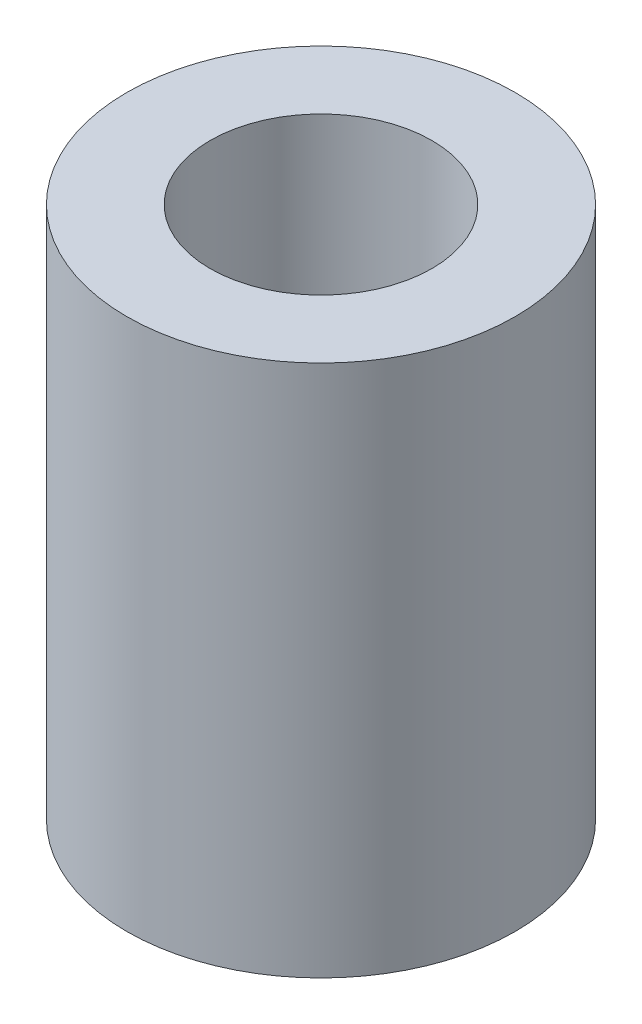
ISO-10303-21;
HEADER;
FILE_DESCRIPTION(('STEP AP214'),'2;1');
FILE_NAME('part.step','',(''),(''),'','','');
FILE_SCHEMA(('AUTOMOTIVE_DESIGN { 1 0 10303 214 1 1 1 1 }'));
ENDSEC;
DATA;
#1=APPLICATION_CONTEXT('core data for automotive mechanical design processes');
#2=APPLICATION_PROTOCOL_DEFINITION('international standard','automotive_design',2000,#1);
#3=PRODUCT_CONTEXT('',#1,'mechanical');
#4=PRODUCT('Part','Part','',(#3));
#5=PRODUCT_RELATED_PRODUCT_CATEGORY('part','',(#4));
#6=PRODUCT_DEFINITION_FORMATION('','',#4);
#7=PRODUCT_DEFINITION_CONTEXT('part definition',#1,'design');
#8=PRODUCT_DEFINITION('design','',#6,#7);
#9=PRODUCT_DEFINITION_SHAPE('','',#8);
#10=(LENGTH_UNIT() NAMED_UNIT(*) SI_UNIT(.MILLI.,.METRE.));
#11=(NAMED_UNIT(*) PLANE_ANGLE_UNIT() SI_UNIT($,.RADIAN.));
#12=(NAMED_UNIT(*) SI_UNIT($,.STERADIAN.) SOLID_ANGLE_UNIT());
#13=UNCERTAINTY_MEASURE_WITH_UNIT(LENGTH_MEASURE(1.E-05),#10,'distance_accuracy_value','');
#14=(GEOMETRIC_REPRESENTATION_CONTEXT(3) GLOBAL_UNCERTAINTY_ASSIGNED_CONTEXT((#13)) GLOBAL_UNIT_ASSIGNED_CONTEXT((#10,
#11,#12)) REPRESENTATION_CONTEXT('',''));
#15=CARTESIAN_POINT('',(0.,0.,0.));
#16=DIRECTION('',(0.,0.,1.));
#17=DIRECTION('',(1.,0.,0.));
#18=AXIS2_PLACEMENT_3D('',#15,#16,#17);
#19=CARTESIAN_POINT('',(0.,12.192,0.));
#20=DIRECTION('',(0.,1.,0.));
#21=DIRECTION('',(0.,0.,1.));
#22=AXIS2_PLACEMENT_3D('',#19,#20,#21);
#23=PLANE('',#22);
#24=CARTESIAN_POINT('',(0.,12.192,0.));
#25=DIRECTION('',(0.,1.,0.));
#26=DIRECTION('',(0.,0.,1.));
#27=AXIS2_PLACEMENT_3D('',#24,#25,#26);
#28=CIRCLE('',#27,4.445);
#29=CARTESIAN_POINT('',(0.,12.192,-4.445));
#30=VERTEX_POINT('',#29);
#31=EDGE_CURVE('E10',#30,#30,#28,.T.);
#32=ORIENTED_EDGE('',*,*,#31,.T.);
#33=EDGE_LOOP('',(#32));
#34=FACE_BOUND('',#33,.T.);
#35=CARTESIAN_POINT('',(0.,12.192,0.));
#36=DIRECTION('',(0.,1.,0.));
#37=DIRECTION('',(0.,0.,1.));
#38=AXIS2_PLACEMENT_3D('',#35,#36,#37);
#39=CIRCLE('',#38,2.54);
#40=CARTESIAN_POINT('',(0.,12.192,-2.54));
#41=VERTEX_POINT('',#40);
#42=EDGE_CURVE('E46',#41,#41,#39,.T.);
#43=ORIENTED_EDGE('',*,*,#42,.F.);
#44=EDGE_LOOP('',(#43));
#45=FACE_BOUND('',#44,.T.);
#46=ADVANCED_FACE('F35',(#34,#45),#23,.T.);
#47=CARTESIAN_POINT('',(0.,0.,0.));
#48=DIRECTION('',(0.,1.,0.));
#49=DIRECTION('',(0.,0.,1.));
#50=AXIS2_PLACEMENT_3D('',#47,#48,#49);
#51=PLANE('',#50);
#52=CARTESIAN_POINT('',(0.,0.,0.));
#53=DIRECTION('',(0.,1.,0.));
#54=DIRECTION('',(0.,0.,1.));
#55=AXIS2_PLACEMENT_3D('',#52,#53,#54);
#56=CIRCLE('',#55,4.445);
#57=CARTESIAN_POINT('',(0.,0.,-4.445));
#58=VERTEX_POINT('',#57);
#59=EDGE_CURVE('E39',#58,#58,#56,.T.);
#60=ORIENTED_EDGE('',*,*,#59,.F.);
#61=EDGE_LOOP('',(#60));
#62=FACE_BOUND('',#61,.T.);
#63=CARTESIAN_POINT('',(0.,0.,0.));
#64=DIRECTION('',(0.,1.,0.));
#65=DIRECTION('',(0.,0.,1.));
#66=AXIS2_PLACEMENT_3D('',#63,#64,#65);
#67=CIRCLE('',#66,2.54);
#68=CARTESIAN_POINT('',(0.,0.,-2.54));
#69=VERTEX_POINT('',#68);
#70=EDGE_CURVE('E48',#69,#69,#67,.T.);
#71=ORIENTED_EDGE('',*,*,#70,.T.);
#72=EDGE_LOOP('',(#71));
#73=FACE_BOUND('',#72,.T.);
#74=ADVANCED_FACE('F58',(#62,#73),#51,.F.);
#75=CARTESIAN_POINT('',(0.,12.192,0.));
#76=DIRECTION('',(0.,-1.,0.));
#77=DIRECTION('',(0.,0.,-1.));
#78=AXIS2_PLACEMENT_3D('',#75,#76,#77);
#79=CYLINDRICAL_SURFACE('',#78,4.445);
#80=CARTESIAN_POINT('',(0.,12.192,-4.445));
#81=CARTESIAN_POINT('',(0.,12.065,-4.445));
#82=CARTESIAN_POINT('',(0.,11.938,-4.445));
#83=CARTESIAN_POINT('',(0.,11.684,-4.445));
#84=CARTESIAN_POINT('',(0.,11.557,-4.445));
#85=CARTESIAN_POINT('',(0.,11.303,-4.445));
#86=CARTESIAN_POINT('',(0.,11.176,-4.445));
#87=CARTESIAN_POINT('',(0.,10.922,-4.445));
#88=CARTESIAN_POINT('',(0.,10.795,-4.445));
#89=CARTESIAN_POINT('',(0.,10.541,-4.445));
#90=CARTESIAN_POINT('',(0.,10.414,-4.445));
#91=CARTESIAN_POINT('',(0.,10.16,-4.445));
#92=CARTESIAN_POINT('',(0.,10.033,-4.445));
#93=CARTESIAN_POINT('',(0.,9.779,-4.445));
#94=CARTESIAN_POINT('',(0.,9.652,-4.445));
#95=CARTESIAN_POINT('',(0.,9.398,-4.445));
#96=CARTESIAN_POINT('',(0.,9.271,-4.445));
#97=CARTESIAN_POINT('',(0.,9.017,-4.445));
#98=CARTESIAN_POINT('',(0.,8.89,-4.445));
#99=CARTESIAN_POINT('',(0.,8.636,-4.445));
#100=CARTESIAN_POINT('',(0.,8.509,-4.445));
#101=CARTESIAN_POINT('',(0.,8.255,-4.445));
#102=CARTESIAN_POINT('',(0.,8.128,-4.445));
#103=CARTESIAN_POINT('',(0.,7.874,-4.445));
#104=CARTESIAN_POINT('',(0.,7.747,-4.445));
#105=CARTESIAN_POINT('',(0.,7.493,-4.445));
#106=CARTESIAN_POINT('',(0.,7.366,-4.445));
#107=CARTESIAN_POINT('',(0.,7.112,-4.445));
#108=CARTESIAN_POINT('',(0.,6.985,-4.445));
#109=CARTESIAN_POINT('',(0.,6.731,-4.445));
#110=CARTESIAN_POINT('',(0.,6.604,-4.445));
#111=CARTESIAN_POINT('',(0.,6.35,-4.445));
#112=CARTESIAN_POINT('',(0.,6.223,-4.445));
#113=CARTESIAN_POINT('',(0.,5.969,-4.445));
#114=CARTESIAN_POINT('',(0.,5.842,-4.445));
#115=CARTESIAN_POINT('',(0.,5.588,-4.445));
#116=CARTESIAN_POINT('',(0.,5.461,-4.445));
#117=CARTESIAN_POINT('',(0.,5.207,-4.445));
#118=CARTESIAN_POINT('',(0.,5.08,-4.445));
#119=CARTESIAN_POINT('',(0.,4.826,-4.445));
#120=CARTESIAN_POINT('',(0.,4.699,-4.445));
#121=CARTESIAN_POINT('',(0.,4.445,-4.445));
#122=CARTESIAN_POINT('',(0.,4.318,-4.445));
#123=CARTESIAN_POINT('',(0.,4.064,-4.445));
#124=CARTESIAN_POINT('',(0.,3.937,-4.445));
#125=CARTESIAN_POINT('',(0.,3.683,-4.445));
#126=CARTESIAN_POINT('',(0.,3.556,-4.445));
#127=CARTESIAN_POINT('',(0.,3.302,-4.445));
#128=CARTESIAN_POINT('',(0.,3.175,-4.445));
#129=CARTESIAN_POINT('',(0.,2.921,-4.445));
#130=CARTESIAN_POINT('',(0.,2.794,-4.445));
#131=CARTESIAN_POINT('',(0.,2.54,-4.445));
#132=CARTESIAN_POINT('',(0.,2.413,-4.445));
#133=CARTESIAN_POINT('',(0.,2.159,-4.445));
#134=CARTESIAN_POINT('',(0.,2.032,-4.445));
#135=CARTESIAN_POINT('',(0.,1.778,-4.445));
#136=CARTESIAN_POINT('',(0.,1.651,-4.445));
#137=CARTESIAN_POINT('',(0.,1.397,-4.445));
#138=CARTESIAN_POINT('',(0.,1.27,-4.445));
#139=CARTESIAN_POINT('',(0.,1.016,-4.445));
#140=CARTESIAN_POINT('',(0.,0.889,-4.445));
#141=CARTESIAN_POINT('',(0.,0.635,-4.445));
#142=CARTESIAN_POINT('',(0.,0.508,-4.445));
#143=CARTESIAN_POINT('',(0.,0.254,-4.445));
#144=CARTESIAN_POINT('',(0.,0.127,-4.445));
#145=CARTESIAN_POINT('',(0.,0.,-4.445));
#146=B_SPLINE_CURVE_WITH_KNOTS('',3,(#80,#81,#82,#83,#84,#85,#86,#87,#88,#89,#90,#91,#92,#93,
#94,#95,#96,#97,#98,#99,#100,#101,#102,#103,#104,#105,#106,#107,#108,#109,#110,#111,#112,#113,
#114,#115,#116,#117,#118,#119,#120,#121,#122,#123,#124,#125,#126,#127,#128,#129,#130,#131,#132,
#133,#134,#135,#136,#137,#138,#139,#140,#141,#142,#143,#144,#145),.UNSPECIFIED.,.F.,.F.,(4,2,2,
2,2,2,2,2,2,2,2,2,2,2,2,2,2,2,2,2,2,2,2,2,2,2,2,2,2,2,2,2,4),(0.,0.380999999999999,
0.761999999999999,1.143,1.524,1.905,2.286,2.667,3.048,3.429,3.81,4.191,4.572,4.953,5.334,5.715,
6.096,6.477,6.858,7.239,7.62,8.001,8.382,8.763,9.144,9.525,9.906,10.287,10.668,11.049,11.43,
11.811,12.192),.UNSPECIFIED.);
#147=EDGE_CURVE('BSEAM37',#30,#58,#146,.T.);
#148=ORIENTED_EDGE('',*,*,#31,.F.);
#149=ORIENTED_EDGE('',*,*,#59,.T.);
#150=ORIENTED_EDGE('',*,*,#147,.T.);
#151=ORIENTED_EDGE('',*,*,#147,.F.);
#152=EDGE_LOOP('',(#148,#150,#149,#151));
#153=FACE_BOUND('',#152,.T.);
#154=ADVANCED_FACE('F37',(#153),#79,.T.);
#155=CARTESIAN_POINT('',(0.,12.192,0.));
#156=DIRECTION('',(0.,-1.,0.));
#157=DIRECTION('',(0.,0.,-1.));
#158=AXIS2_PLACEMENT_3D('',#155,#156,#157);
#159=CYLINDRICAL_SURFACE('',#158,2.54);
#160=CARTESIAN_POINT('',(0.,12.192,-2.54));
#161=CARTESIAN_POINT('',(0.,12.065,-2.54));
#162=CARTESIAN_POINT('',(0.,11.938,-2.54));
#163=CARTESIAN_POINT('',(0.,11.684,-2.54));
#164=CARTESIAN_POINT('',(0.,11.557,-2.54));
#165=CARTESIAN_POINT('',(0.,11.303,-2.54));
#166=CARTESIAN_POINT('',(0.,11.176,-2.54));
#167=CARTESIAN_POINT('',(0.,10.922,-2.54));
#168=CARTESIAN_POINT('',(0.,10.795,-2.54));
#169=CARTESIAN_POINT('',(0.,10.541,-2.54));
#170=CARTESIAN_POINT('',(0.,10.414,-2.54));
#171=CARTESIAN_POINT('',(0.,10.16,-2.54));
#172=CARTESIAN_POINT('',(0.,10.033,-2.54));
#173=CARTESIAN_POINT('',(0.,9.779,-2.54));
#174=CARTESIAN_POINT('',(0.,9.652,-2.54));
#175=CARTESIAN_POINT('',(0.,9.398,-2.54));
#176=CARTESIAN_POINT('',(0.,9.271,-2.54));
#177=CARTESIAN_POINT('',(0.,9.017,-2.54));
#178=CARTESIAN_POINT('',(0.,8.89,-2.54));
#179=CARTESIAN_POINT('',(0.,8.636,-2.54));
#180=CARTESIAN_POINT('',(0.,8.509,-2.54));
#181=CARTESIAN_POINT('',(0.,8.255,-2.54));
#182=CARTESIAN_POINT('',(0.,8.128,-2.54));
#183=CARTESIAN_POINT('',(0.,7.874,-2.54));
#184=CARTESIAN_POINT('',(0.,7.747,-2.54));
#185=CARTESIAN_POINT('',(0.,7.493,-2.54));
#186=CARTESIAN_POINT('',(0.,7.366,-2.54));
#187=CARTESIAN_POINT('',(0.,7.112,-2.54));
#188=CARTESIAN_POINT('',(0.,6.985,-2.54));
#189=CARTESIAN_POINT('',(0.,6.731,-2.54));
#190=CARTESIAN_POINT('',(0.,6.604,-2.54));
#191=CARTESIAN_POINT('',(0.,6.35,-2.54));
#192=CARTESIAN_POINT('',(0.,6.223,-2.54));
#193=CARTESIAN_POINT('',(0.,5.969,-2.54));
#194=CARTESIAN_POINT('',(0.,5.842,-2.54));
#195=CARTESIAN_POINT('',(0.,5.588,-2.54));
#196=CARTESIAN_POINT('',(0.,5.461,-2.54));
#197=CARTESIAN_POINT('',(0.,5.207,-2.54));
#198=CARTESIAN_POINT('',(0.,5.08,-2.54));
#199=CARTESIAN_POINT('',(0.,4.826,-2.54));
#200=CARTESIAN_POINT('',(0.,4.699,-2.54));
#201=CARTESIAN_POINT('',(0.,4.445,-2.54));
#202=CARTESIAN_POINT('',(0.,4.318,-2.54));
#203=CARTESIAN_POINT('',(0.,4.064,-2.54));
#204=CARTESIAN_POINT('',(0.,3.937,-2.54));
#205=CARTESIAN_POINT('',(0.,3.683,-2.54));
#206=CARTESIAN_POINT('',(0.,3.556,-2.54));
#207=CARTESIAN_POINT('',(0.,3.302,-2.54));
#208=CARTESIAN_POINT('',(0.,3.175,-2.54));
#209=CARTESIAN_POINT('',(0.,2.921,-2.54));
#210=CARTESIAN_POINT('',(0.,2.794,-2.54));
#211=CARTESIAN_POINT('',(0.,2.54,-2.54));
#212=CARTESIAN_POINT('',(0.,2.413,-2.54));
#213=CARTESIAN_POINT('',(0.,2.159,-2.54));
#214=CARTESIAN_POINT('',(0.,2.032,-2.54));
#215=CARTESIAN_POINT('',(0.,1.778,-2.54));
#216=CARTESIAN_POINT('',(0.,1.651,-2.54));
#217=CARTESIAN_POINT('',(0.,1.397,-2.54));
#218=CARTESIAN_POINT('',(0.,1.27,-2.54));
#219=CARTESIAN_POINT('',(0.,1.016,-2.54));
#220=CARTESIAN_POINT('',(0.,0.889,-2.54));
#221=CARTESIAN_POINT('',(0.,0.635,-2.54));
#222=CARTESIAN_POINT('',(0.,0.508,-2.54));
#223=CARTESIAN_POINT('',(0.,0.254,-2.54));
#224=CARTESIAN_POINT('',(0.,0.127,-2.54));
#225=CARTESIAN_POINT('',(0.,0.,-2.54));
#226=B_SPLINE_CURVE_WITH_KNOTS('',3,(#160,#161,#162,#163,#164,#165,#166,#167,#168,#169,#170,
#171,#172,#173,#174,#175,#176,#177,#178,#179,#180,#181,#182,#183,#184,#185,#186,#187,#188,#189,
#190,#191,#192,#193,#194,#195,#196,#197,#198,#199,#200,#201,#202,#203,#204,#205,#206,#207,#208,
#209,#210,#211,#212,#213,#214,#215,#216,#217,#218,#219,#220,#221,#222,#223,#224,#225),
.UNSPECIFIED.,.F.,.F.,(4,2,2,2,2,2,2,2,2,2,2,2,2,2,2,2,2,2,2,2,2,2,2,2,2,2,2,2,2,2,2,2,4),(0.,
0.381000000000001,0.762000000000001,1.143,1.524,1.905,2.286,2.667,3.048,3.429,3.81,4.191,4.572,
4.953,5.334,5.715,6.096,6.477,6.858,7.239,7.62,8.001,8.382,8.763,9.144,9.525,9.906,10.287,
10.668,11.049,11.43,11.811,12.192),.UNSPECIFIED.);
#227=EDGE_CURVE('BSEAM54',#41,#69,#226,.T.);
#228=ORIENTED_EDGE('',*,*,#42,.T.);
#229=ORIENTED_EDGE('',*,*,#70,.F.);
#230=ORIENTED_EDGE('',*,*,#227,.T.);
#231=ORIENTED_EDGE('',*,*,#227,.F.);
#232=EDGE_LOOP('',(#228,#230,#229,#231));
#233=FACE_BOUND('',#232,.T.);
#234=ADVANCED_FACE('F54',(#233),#159,.F.);
#235=CLOSED_SHELL('',(#46,#74,#154,#234));
#236=MANIFOLD_SOLID_BREP('B2',#235);
#237=ADVANCED_BREP_SHAPE_REPRESENTATION('',(#18,#236),#14);
#238=SHAPE_DEFINITION_REPRESENTATION(#9,#237);
ENDSEC;
END-ISO-10303-21;
